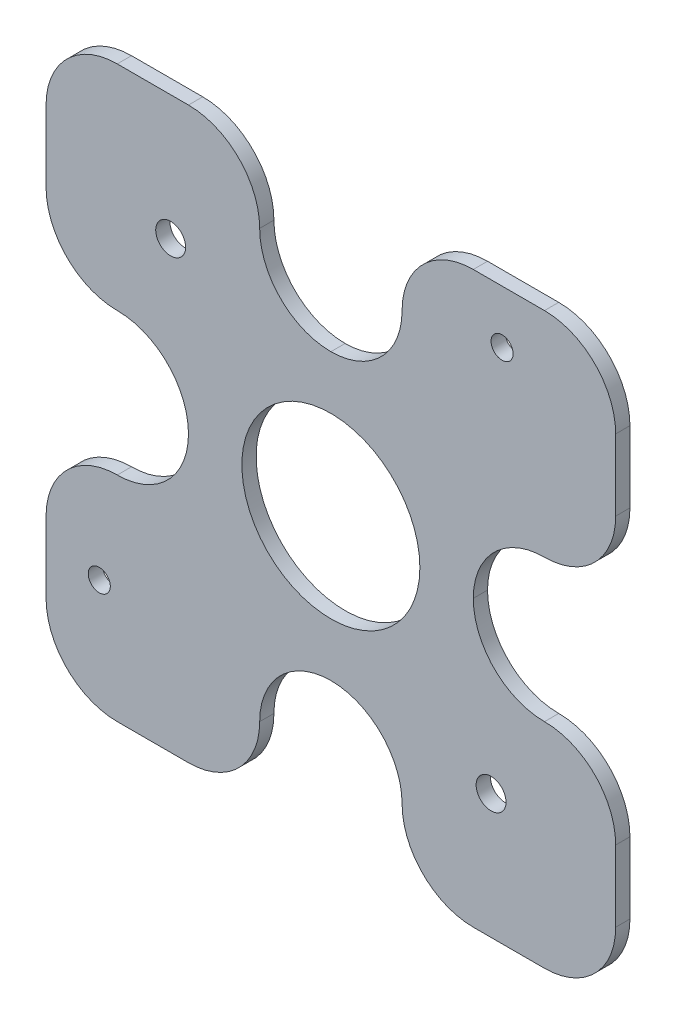
ISO-10303-21;
HEADER;
FILE_DESCRIPTION(('STEP AP214'),'2;1');
FILE_NAME('part.step','',(''),(''),'','','');
FILE_SCHEMA(('AUTOMOTIVE_DESIGN { 1 0 10303 214 1 1 1 1 }'));
ENDSEC;
DATA;
#1=APPLICATION_CONTEXT('core data for automotive mechanical design processes');
#2=APPLICATION_PROTOCOL_DEFINITION('international standard','automotive_design',2000,#1);
#3=PRODUCT_CONTEXT('',#1,'mechanical');
#4=PRODUCT('Part','Part','',(#3));
#5=PRODUCT_RELATED_PRODUCT_CATEGORY('part','',(#4));
#6=PRODUCT_DEFINITION_FORMATION('','',#4);
#7=PRODUCT_DEFINITION_CONTEXT('part definition',#1,'design');
#8=PRODUCT_DEFINITION('design','',#6,#7);
#9=PRODUCT_DEFINITION_SHAPE('','',#8);
#10=(LENGTH_UNIT() NAMED_UNIT(*) SI_UNIT(.MILLI.,.METRE.));
#11=(NAMED_UNIT(*) PLANE_ANGLE_UNIT() SI_UNIT($,.RADIAN.));
#12=(NAMED_UNIT(*) SI_UNIT($,.STERADIAN.) SOLID_ANGLE_UNIT());
#13=UNCERTAINTY_MEASURE_WITH_UNIT(LENGTH_MEASURE(1.E-05),#10,'distance_accuracy_value','');
#14=(GEOMETRIC_REPRESENTATION_CONTEXT(3) GLOBAL_UNCERTAINTY_ASSIGNED_CONTEXT((#13)) GLOBAL_UNIT_ASSIGNED_CONTEXT((#10,
#11,#12)) REPRESENTATION_CONTEXT('',''));
#15=CARTESIAN_POINT('',(0.,0.,0.));
#16=DIRECTION('',(0.,0.,1.));
#17=DIRECTION('',(1.,0.,0.));
#18=AXIS2_PLACEMENT_3D('',#15,#16,#17);
#19=CARTESIAN_POINT('',(0.,0.,2.));
#20=DIRECTION('',(1.,0.,0.));
#21=DIRECTION('',(0.,0.,-1.));
#22=AXIS2_PLACEMENT_3D('',#19,#20,#21);
#23=PLANE('',#22);
#24=DIRECTION('',(0.,-1.,0.));
#25=VECTOR('',#24,1.);
#26=CARTESIAN_POINT('',(0.,0.,0.));
#27=LINE('',#26,#25);
#28=CARTESIAN_POINT('',(0.,70.,0.));
#29=VERTEX_POINT('',#28);
#30=CARTESIAN_POINT('',(0.,60.0000000000001,0.));
#31=VERTEX_POINT('',#30);
#32=EDGE_CURVE('E239',#29,#31,#27,.T.);
#33=ORIENTED_EDGE('',*,*,#32,.T.);
#34=DIRECTION('',(0.,0.,1.));
#35=VECTOR('',#34,1.);
#36=CARTESIAN_POINT('',(0.,60.0000000000001,2.));
#37=LINE('',#36,#35);
#38=CARTESIAN_POINT('',(0.,60.0000000000001,2.));
#39=VERTEX_POINT('',#38);
#40=EDGE_CURVE('E243',#31,#39,#37,.T.);
#41=ORIENTED_EDGE('',*,*,#40,.T.);
#42=DIRECTION('',(0.,-1.,0.));
#43=VECTOR('',#42,1.);
#44=CARTESIAN_POINT('',(0.,0.,2.));
#45=LINE('',#44,#43);
#46=CARTESIAN_POINT('',(0.,70.,2.));
#47=VERTEX_POINT('',#46);
#48=EDGE_CURVE('E242',#47,#39,#45,.T.);
#49=ORIENTED_EDGE('',*,*,#48,.F.);
#50=DIRECTION('',(0.,0.,-1.));
#51=VECTOR('',#50,1.);
#52=CARTESIAN_POINT('',(0.,70.,2.));
#53=LINE('',#52,#51);
#54=EDGE_CURVE('E227',#47,#29,#53,.T.);
#55=ORIENTED_EDGE('',*,*,#54,.T.);
#56=EDGE_LOOP('',(#33,#41,#49,#55));
#57=FACE_BOUND('',#56,.T.);
#58=ADVANCED_FACE('F39',(#57),#23,.F.);
#59=CARTESIAN_POINT('',(0.,0.,2.));
#60=DIRECTION('',(0.,1.,0.));
#61=DIRECTION('',(0.,0.,1.));
#62=AXIS2_PLACEMENT_3D('',#59,#60,#61);
#63=PLANE('',#62);
#64=DIRECTION('',(1.,0.,0.));
#65=VECTOR('',#64,1.);
#66=CARTESIAN_POINT('',(0.,0.,2.));
#67=LINE('',#66,#65);
#68=CARTESIAN_POINT('',(10.,0.,2.));
#69=VERTEX_POINT('',#68);
#70=CARTESIAN_POINT('',(20.0000000000002,0.,2.));
#71=VERTEX_POINT('',#70);
#72=EDGE_CURVE('E431',#69,#71,#67,.T.);
#73=ORIENTED_EDGE('',*,*,#72,.F.);
#74=DIRECTION('',(0.,0.,-1.));
#75=VECTOR('',#74,1.);
#76=CARTESIAN_POINT('',(10.,0.,2.));
#77=LINE('',#76,#75);
#78=CARTESIAN_POINT('',(10.,0.,0.));
#79=VERTEX_POINT('',#78);
#80=EDGE_CURVE('E321',#69,#79,#77,.T.);
#81=ORIENTED_EDGE('',*,*,#80,.T.);
#82=DIRECTION('',(1.,0.,0.));
#83=VECTOR('',#82,1.);
#84=CARTESIAN_POINT('',(0.,0.,0.));
#85=LINE('',#84,#83);
#86=CARTESIAN_POINT('',(20.0000000000002,0.,0.));
#87=VERTEX_POINT('',#86);
#88=EDGE_CURVE('E254',#79,#87,#85,.T.);
#89=ORIENTED_EDGE('',*,*,#88,.T.);
#90=DIRECTION('',(0.,0.,1.));
#91=VECTOR('',#90,1.);
#92=CARTESIAN_POINT('',(20.0000000000002,0.,2.));
#93=LINE('',#92,#91);
#94=EDGE_CURVE('E318',#87,#71,#93,.T.);
#95=ORIENTED_EDGE('',*,*,#94,.T.);
#96=EDGE_LOOP('',(#73,#81,#89,#95));
#97=FACE_BOUND('',#96,.T.);
#98=ADVANCED_FACE('F488',(#97),#63,.F.);
#99=CARTESIAN_POINT('',(80.,0.,2.));
#100=DIRECTION('',(-1.,0.,0.));
#101=DIRECTION('',(0.,0.,1.));
#102=AXIS2_PLACEMENT_3D('',#99,#100,#101);
#103=PLANE('',#102);
#104=DIRECTION('',(0.,1.,0.));
#105=VECTOR('',#104,1.);
#106=CARTESIAN_POINT('',(80.,0.,2.));
#107=LINE('',#106,#105);
#108=CARTESIAN_POINT('',(80.,10.,2.));
#109=VERTEX_POINT('',#108);
#110=CARTESIAN_POINT('',(80.,20.0000000000001,2.));
#111=VERTEX_POINT('',#110);
#112=EDGE_CURVE('E425',#109,#111,#107,.T.);
#113=ORIENTED_EDGE('',*,*,#112,.F.);
#114=DIRECTION('',(0.,0.,-1.));
#115=VECTOR('',#114,1.);
#116=CARTESIAN_POINT('',(80.,10.,2.));
#117=LINE('',#116,#115);
#118=CARTESIAN_POINT('',(80.,10.,0.));
#119=VERTEX_POINT('',#118);
#120=EDGE_CURVE('E331',#109,#119,#117,.T.);
#121=ORIENTED_EDGE('',*,*,#120,.T.);
#122=DIRECTION('',(0.,1.,0.));
#123=VECTOR('',#122,1.);
#124=CARTESIAN_POINT('',(80.,0.,0.));
#125=LINE('',#124,#123);
#126=CARTESIAN_POINT('',(80.,20.0000000000001,0.));
#127=VERTEX_POINT('',#126);
#128=EDGE_CURVE('E264',#119,#127,#125,.T.);
#129=ORIENTED_EDGE('',*,*,#128,.T.);
#130=DIRECTION('',(0.,0.,1.));
#131=VECTOR('',#130,1.);
#132=CARTESIAN_POINT('',(80.,20.0000000000001,2.));
#133=LINE('',#132,#131);
#134=EDGE_CURVE('E328',#127,#111,#133,.T.);
#135=ORIENTED_EDGE('',*,*,#134,.T.);
#136=EDGE_LOOP('',(#113,#121,#129,#135));
#137=FACE_BOUND('',#136,.T.);
#138=ADVANCED_FACE('F483',(#137),#103,.F.);
#139=CARTESIAN_POINT('',(0.,80.,2.));
#140=DIRECTION('',(0.,-1.,0.));
#141=DIRECTION('',(0.,0.,-1.));
#142=AXIS2_PLACEMENT_3D('',#139,#140,#141);
#143=PLANE('',#142);
#144=DIRECTION('',(-1.,0.,0.));
#145=VECTOR('',#144,1.);
#146=CARTESIAN_POINT('',(0.,80.,2.));
#147=LINE('',#146,#145);
#148=CARTESIAN_POINT('',(70.,80.,2.));
#149=VERTEX_POINT('',#148);
#150=CARTESIAN_POINT('',(60.0000000000002,80.,2.));
#151=VERTEX_POINT('',#150);
#152=EDGE_CURVE('E244',#149,#151,#147,.T.);
#153=ORIENTED_EDGE('',*,*,#152,.F.);
#154=DIRECTION('',(0.,0.,-1.));
#155=VECTOR('',#154,1.);
#156=CARTESIAN_POINT('',(70.,80.,2.));
#157=LINE('',#156,#155);
#158=CARTESIAN_POINT('',(70.,80.,0.));
#159=VERTEX_POINT('',#158);
#160=EDGE_CURVE('E341',#149,#159,#157,.T.);
#161=ORIENTED_EDGE('',*,*,#160,.T.);
#162=DIRECTION('',(-1.,0.,0.));
#163=VECTOR('',#162,1.);
#164=CARTESIAN_POINT('',(0.,80.,0.));
#165=LINE('',#164,#163);
#166=CARTESIAN_POINT('',(60.0000000000002,80.,0.));
#167=VERTEX_POINT('',#166);
#168=EDGE_CURVE('E268',#159,#167,#165,.T.);
#169=ORIENTED_EDGE('',*,*,#168,.T.);
#170=DIRECTION('',(0.,0.,1.));
#171=VECTOR('',#170,1.);
#172=CARTESIAN_POINT('',(60.0000000000002,80.,2.));
#173=LINE('',#172,#171);
#174=EDGE_CURVE('E338',#167,#151,#173,.T.);
#175=ORIENTED_EDGE('',*,*,#174,.T.);
#176=EDGE_LOOP('',(#153,#161,#169,#175));
#177=FACE_BOUND('',#176,.T.);
#178=ADVANCED_FACE('F475',(#177),#143,.F.);
#179=CARTESIAN_POINT('',(0.,0.,2.));
#180=DIRECTION('',(0.,0.,-1.));
#181=DIRECTION('',(-1.,0.,0.));
#182=AXIS2_PLACEMENT_3D('',#179,#180,#181);
#183=PLANE('',#182);
#184=CARTESIAN_POINT('',(40.0000000000003,40.,2.));
#185=DIRECTION('',(0.,0.,1.));
#186=DIRECTION('',(1.,0.,0.));
#187=AXIS2_PLACEMENT_3D('',#184,#185,#186);
#188=CIRCLE('',#187,12.5);
#189=CARTESIAN_POINT('',(52.5000000000003,40.,2.));
#190=VERTEX_POINT('',#189);
#191=EDGE_CURVE('E461',#190,#190,#188,.T.);
#192=ORIENTED_EDGE('',*,*,#191,.F.);
#193=EDGE_LOOP('',(#192));
#194=FACE_BOUND('',#193,.T.);
#195=ORIENTED_EDGE('',*,*,#48,.T.);
#196=CARTESIAN_POINT('',(10.,60.0000000000001,2.));
#197=DIRECTION('',(0.,0.,-1.));
#198=DIRECTION('',(-1.,0.,0.));
#199=AXIS2_PLACEMENT_3D('',#196,#197,#198);
#200=CIRCLE('',#199,10.);
#201=CARTESIAN_POINT('',(10.,50.0000000000001,2.));
#202=VERTEX_POINT('',#201);
#203=EDGE_CURVE('E233',#39,#202,#200,.F.);
#204=ORIENTED_EDGE('',*,*,#203,.T.);
#205=CARTESIAN_POINT('',(10.0000000000003,40.0000000000001,2.));
#206=DIRECTION('',(0.,0.,-1.));
#207=DIRECTION('',(-1.,0.,0.));
#208=AXIS2_PLACEMENT_3D('',#205,#206,#207);
#209=CIRCLE('',#208,10.);
#210=CARTESIAN_POINT('',(20.0000000000003,40.0000000000001,2.));
#211=VERTEX_POINT('',#210);
#212=EDGE_CURVE('E347',#202,#211,#209,.T.);
#213=ORIENTED_EDGE('',*,*,#212,.T.);
#214=CARTESIAN_POINT('',(10.0000000000003,40.0000000000001,2.));
#215=DIRECTION('',(0.,0.,-1.));
#216=DIRECTION('',(-1.,0.,0.));
#217=AXIS2_PLACEMENT_3D('',#214,#215,#216);
#218=CIRCLE('',#217,10.);
#219=CARTESIAN_POINT('',(10.,30.0000000000001,2.));
#220=VERTEX_POINT('',#219);
#221=EDGE_CURVE('E351',#211,#220,#218,.T.);
#222=ORIENTED_EDGE('',*,*,#221,.T.);
#223=CARTESIAN_POINT('',(10.,20.0000000000001,2.));
#224=DIRECTION('',(0.,0.,-1.));
#225=DIRECTION('',(-1.,0.,0.));
#226=AXIS2_PLACEMENT_3D('',#223,#224,#225);
#227=CIRCLE('',#226,10.);
#228=CARTESIAN_POINT('',(0.,20.0000000000001,2.));
#229=VERTEX_POINT('',#228);
#230=EDGE_CURVE('E291',#220,#229,#227,.F.);
#231=ORIENTED_EDGE('',*,*,#230,.T.);
#232=CARTESIAN_POINT('',(0.,10.,2.));
#233=VERTEX_POINT('',#232);
#234=EDGE_CURVE('E436',#229,#233,#45,.T.);
#235=ORIENTED_EDGE('',*,*,#234,.T.);
#236=CARTESIAN_POINT('',(10.,10.,2.));
#237=DIRECTION('',(0.,0.,-1.));
#238=DIRECTION('',(-1.,0.,0.));
#239=AXIS2_PLACEMENT_3D('',#236,#237,#238);
#240=CIRCLE('',#239,10.);
#241=EDGE_CURVE('E289',#233,#69,#240,.F.);
#242=ORIENTED_EDGE('',*,*,#241,.T.);
#243=ORIENTED_EDGE('',*,*,#72,.T.);
#244=CARTESIAN_POINT('',(20.0000000000002,10.,2.));
#245=DIRECTION('',(0.,0.,-1.));
#246=DIRECTION('',(-1.,0.,0.));
#247=AXIS2_PLACEMENT_3D('',#244,#245,#246);
#248=CIRCLE('',#247,10.);
#249=CARTESIAN_POINT('',(30.0000000000002,10.,2.));
#250=VERTEX_POINT('',#249);
#251=EDGE_CURVE('E287',#71,#250,#248,.F.);
#252=ORIENTED_EDGE('',*,*,#251,.T.);
#253=CARTESIAN_POINT('',(40.0000000000002,10.0000000000002,2.));
#254=DIRECTION('',(0.,0.,-1.));
#255=DIRECTION('',(-1.,0.,0.));
#256=AXIS2_PLACEMENT_3D('',#253,#254,#255);
#257=CIRCLE('',#256,10.);
#258=CARTESIAN_POINT('',(40.0000000000002,20.0000000000002,2.));
#259=VERTEX_POINT('',#258);
#260=EDGE_CURVE('E355',#250,#259,#257,.T.);
#261=ORIENTED_EDGE('',*,*,#260,.T.);
#262=CARTESIAN_POINT('',(40.0000000000002,10.0000000000002,2.));
#263=DIRECTION('',(0.,0.,-1.));
#264=DIRECTION('',(-1.,0.,0.));
#265=AXIS2_PLACEMENT_3D('',#262,#263,#264);
#266=CIRCLE('',#265,10.);
#267=CARTESIAN_POINT('',(50.0000000000002,10.,2.));
#268=VERTEX_POINT('',#267);
#269=EDGE_CURVE('E359',#259,#268,#266,.T.);
#270=ORIENTED_EDGE('',*,*,#269,.T.);
#271=CARTESIAN_POINT('',(60.0000000000002,10.,2.));
#272=DIRECTION('',(0.,0.,-1.));
#273=DIRECTION('',(-1.,0.,0.));
#274=AXIS2_PLACEMENT_3D('',#271,#272,#273);
#275=CIRCLE('',#274,10.);
#276=CARTESIAN_POINT('',(60.0000000000002,0.,2.));
#277=VERTEX_POINT('',#276);
#278=EDGE_CURVE('E285',#268,#277,#275,.F.);
#279=ORIENTED_EDGE('',*,*,#278,.T.);
#280=CARTESIAN_POINT('',(70.,0.,2.));
#281=VERTEX_POINT('',#280);
#282=EDGE_CURVE('E433',#277,#281,#67,.T.);
#283=ORIENTED_EDGE('',*,*,#282,.T.);
#284=CARTESIAN_POINT('',(70.,10.,2.));
#285=DIRECTION('',(0.,0.,-1.));
#286=DIRECTION('',(-1.,0.,0.));
#287=AXIS2_PLACEMENT_3D('',#284,#285,#286);
#288=CIRCLE('',#287,10.);
#289=EDGE_CURVE('E283',#281,#109,#288,.F.);
#290=ORIENTED_EDGE('',*,*,#289,.T.);
#291=ORIENTED_EDGE('',*,*,#112,.T.);
#292=CARTESIAN_POINT('',(70.,20.0000000000001,2.));
#293=DIRECTION('',(0.,0.,-1.));
#294=DIRECTION('',(-1.,0.,0.));
#295=AXIS2_PLACEMENT_3D('',#292,#293,#294);
#296=CIRCLE('',#295,10.);
#297=CARTESIAN_POINT('',(70.,30.0000000000001,2.));
#298=VERTEX_POINT('',#297);
#299=EDGE_CURVE('E281',#111,#298,#296,.F.);
#300=ORIENTED_EDGE('',*,*,#299,.T.);
#301=CARTESIAN_POINT('',(70.0000000000001,40.0000000000001,2.));
#302=DIRECTION('',(0.,0.,-1.));
#303=DIRECTION('',(-1.,0.,0.));
#304=AXIS2_PLACEMENT_3D('',#301,#302,#303);
#305=CIRCLE('',#304,10.);
#306=CARTESIAN_POINT('',(60.0000000000001,40.0000000000001,2.));
#307=VERTEX_POINT('',#306);
#308=EDGE_CURVE('E363',#298,#307,#305,.T.);
#309=ORIENTED_EDGE('',*,*,#308,.T.);
#310=CARTESIAN_POINT('',(70.0000000000001,40.0000000000001,2.));
#311=DIRECTION('',(0.,0.,-1.));
#312=DIRECTION('',(-1.,0.,0.));
#313=AXIS2_PLACEMENT_3D('',#310,#311,#312);
#314=CIRCLE('',#313,10.);
#315=CARTESIAN_POINT('',(70.,50.0000000000001,2.));
#316=VERTEX_POINT('',#315);
#317=EDGE_CURVE('E367',#307,#316,#314,.T.);
#318=ORIENTED_EDGE('',*,*,#317,.T.);
#319=CARTESIAN_POINT('',(70.,60.0000000000001,2.));
#320=DIRECTION('',(0.,0.,-1.));
#321=DIRECTION('',(-1.,0.,0.));
#322=AXIS2_PLACEMENT_3D('',#319,#320,#321);
#323=CIRCLE('',#322,10.);
#324=CARTESIAN_POINT('',(80.,60.0000000000001,2.));
#325=VERTEX_POINT('',#324);
#326=EDGE_CURVE('E279',#316,#325,#323,.F.);
#327=ORIENTED_EDGE('',*,*,#326,.T.);
#328=CARTESIAN_POINT('',(80.,70.,2.));
#329=VERTEX_POINT('',#328);
#330=EDGE_CURVE('E428',#325,#329,#107,.T.);
#331=ORIENTED_EDGE('',*,*,#330,.T.);
#332=CARTESIAN_POINT('',(70.,70.,2.));
#333=DIRECTION('',(0.,0.,-1.));
#334=DIRECTION('',(-1.,0.,0.));
#335=AXIS2_PLACEMENT_3D('',#332,#333,#334);
#336=CIRCLE('',#335,10.);
#337=EDGE_CURVE('E277',#329,#149,#336,.F.);
#338=ORIENTED_EDGE('',*,*,#337,.T.);
#339=ORIENTED_EDGE('',*,*,#152,.T.);
#340=CARTESIAN_POINT('',(60.0000000000002,70.,2.));
#341=DIRECTION('',(0.,0.,-1.));
#342=DIRECTION('',(-1.,0.,0.));
#343=AXIS2_PLACEMENT_3D('',#340,#341,#342);
#344=CIRCLE('',#343,10.);
#345=CARTESIAN_POINT('',(50.0000000000002,70.,2.));
#346=VERTEX_POINT('',#345);
#347=EDGE_CURVE('E275',#151,#346,#344,.F.);
#348=ORIENTED_EDGE('',*,*,#347,.T.);
#349=CARTESIAN_POINT('',(40.0000000000002,70.,2.));
#350=DIRECTION('',(0.,0.,-1.));
#351=DIRECTION('',(-1.,0.,0.));
#352=AXIS2_PLACEMENT_3D('',#349,#350,#351);
#353=CIRCLE('',#352,10.);
#354=CARTESIAN_POINT('',(40.0000000000002,60.,2.));
#355=VERTEX_POINT('',#354);
#356=EDGE_CURVE('E62',#346,#355,#353,.T.);
#357=ORIENTED_EDGE('',*,*,#356,.T.);
#358=CARTESIAN_POINT('',(40.0000000000002,70.,2.));
#359=DIRECTION('',(0.,0.,-1.));
#360=DIRECTION('',(-1.,0.,0.));
#361=AXIS2_PLACEMENT_3D('',#358,#359,#360);
#362=CIRCLE('',#361,10.);
#363=CARTESIAN_POINT('',(30.0000000000002,70.,2.));
#364=VERTEX_POINT('',#363);
#365=EDGE_CURVE('E48',#355,#364,#362,.T.);
#366=ORIENTED_EDGE('',*,*,#365,.T.);
#367=CARTESIAN_POINT('',(20.0000000000002,70.,2.));
#368=DIRECTION('',(0.,0.,-1.));
#369=DIRECTION('',(-1.,0.,0.));
#370=AXIS2_PLACEMENT_3D('',#367,#368,#369);
#371=CIRCLE('',#370,10.);
#372=CARTESIAN_POINT('',(20.0000000000002,80.,2.));
#373=VERTEX_POINT('',#372);
#374=EDGE_CURVE('E273',#364,#373,#371,.F.);
#375=ORIENTED_EDGE('',*,*,#374,.T.);
#376=CARTESIAN_POINT('',(10.,80.,2.));
#377=VERTEX_POINT('',#376);
#378=EDGE_CURVE('E259',#373,#377,#147,.T.);
#379=ORIENTED_EDGE('',*,*,#378,.T.);
#380=CARTESIAN_POINT('',(10.,70.,2.));
#381=DIRECTION('',(0.,0.,-1.));
#382=DIRECTION('',(-1.,0.,0.));
#383=AXIS2_PLACEMENT_3D('',#380,#381,#382);
#384=CIRCLE('',#383,10.);
#385=EDGE_CURVE('E271',#377,#47,#384,.F.);
#386=ORIENTED_EDGE('',*,*,#385,.T.);
#387=EDGE_LOOP('',(#195,#204,#213,#222,#231,#235,#242,#243,#252,#261,#270,#279,#283,#290,#291,
#300,#309,#318,#327,#331,#338,#339,#348,#357,#366,#375,#379,#386));
#388=FACE_BOUND('',#387,.T.);
#389=CARTESIAN_POINT('',(17.5,62.5,2.));
#390=DIRECTION('',(0.,0.,1.));
#391=DIRECTION('',(1.,0.,0.));
#392=AXIS2_PLACEMENT_3D('',#389,#390,#391);
#393=CIRCLE('',#392,2.1);
#394=CARTESIAN_POINT('',(19.6,62.5,2.));
#395=VERTEX_POINT('',#394);
#396=EDGE_CURVE('E257',#395,#395,#393,.T.);
#397=ORIENTED_EDGE('',*,*,#396,.F.);
#398=EDGE_LOOP('',(#397));
#399=FACE_BOUND('',#398,.T.);
#400=CARTESIAN_POINT('',(62.5,17.5,2.));
#401=DIRECTION('',(0.,0.,1.));
#402=DIRECTION('',(1.,0.,0.));
#403=AXIS2_PLACEMENT_3D('',#400,#401,#402);
#404=CIRCLE('',#403,2.10000000000009);
#405=CARTESIAN_POINT('',(64.6000000000001,17.5,2.));
#406=VERTEX_POINT('',#405);
#407=EDGE_CURVE('E442',#406,#406,#404,.T.);
#408=ORIENTED_EDGE('',*,*,#407,.F.);
#409=EDGE_LOOP('',(#408));
#410=FACE_BOUND('',#409,.T.);
#411=CARTESIAN_POINT('',(7.47308806541882,15.9583694396574,2.));
#412=DIRECTION('',(0.,0.,1.));
#413=DIRECTION('',(1.,0.,0.));
#414=AXIS2_PLACEMENT_3D('',#411,#412,#413);
#415=CIRCLE('',#414,1.55);
#416=CARTESIAN_POINT('',(9.02308806541882,15.9583694396574,2.));
#417=VERTEX_POINT('',#416);
#418=EDGE_CURVE('E448',#417,#417,#415,.T.);
#419=ORIENTED_EDGE('',*,*,#418,.F.);
#420=EDGE_LOOP('',(#419));
#421=FACE_BOUND('',#420,.T.);
#422=CARTESIAN_POINT('',(64.0416305603426,72.5269119345812,2.));
#423=DIRECTION('',(0.,0.,1.));
#424=DIRECTION('',(-1.,0.,0.));
#425=AXIS2_PLACEMENT_3D('',#422,#423,#424);
#426=CIRCLE('',#425,1.54999999999999);
#427=CARTESIAN_POINT('',(62.4916305603426,72.5269119345812,2.));
#428=VERTEX_POINT('',#427);
#429=EDGE_CURVE('E454',#428,#428,#426,.T.);
#430=ORIENTED_EDGE('',*,*,#429,.F.);
#431=EDGE_LOOP('',(#430));
#432=FACE_BOUND('',#431,.T.);
#433=ADVANCED_FACE('F421',(#194,#388,#399,#410,#421,#432),#183,.F.);
#434=CARTESIAN_POINT('',(0.,0.,0.));
#435=DIRECTION('',(0.,0.,-1.));
#436=DIRECTION('',(-1.,0.,0.));
#437=AXIS2_PLACEMENT_3D('',#434,#435,#436);
#438=PLANE('',#437);
#439=CARTESIAN_POINT('',(40.0000000000003,40.,0.));
#440=DIRECTION('',(0.,0.,1.));
#441=DIRECTION('',(1.,0.,0.));
#442=AXIS2_PLACEMENT_3D('',#439,#440,#441);
#443=CIRCLE('',#442,12.5);
#444=CARTESIAN_POINT('',(52.5000000000003,40.,0.));
#445=VERTEX_POINT('',#444);
#446=EDGE_CURVE('E406',#445,#445,#443,.T.);
#447=ORIENTED_EDGE('',*,*,#446,.T.);
#448=EDGE_LOOP('',(#447));
#449=FACE_BOUND('',#448,.T.);
#450=CARTESIAN_POINT('',(10.,20.0000000000001,0.));
#451=DIRECTION('',(0.,0.,-1.));
#452=DIRECTION('',(-1.,0.,0.));
#453=AXIS2_PLACEMENT_3D('',#450,#451,#452);
#454=CIRCLE('',#453,10.);
#455=CARTESIAN_POINT('',(0.,20.0000000000001,0.));
#456=VERTEX_POINT('',#455);
#457=CARTESIAN_POINT('',(10.,30.0000000000001,0.));
#458=VERTEX_POINT('',#457);
#459=EDGE_CURVE('E311',#456,#458,#454,.T.);
#460=ORIENTED_EDGE('',*,*,#459,.T.);
#461=CARTESIAN_POINT('',(10.0000000000003,40.0000000000001,0.));
#462=DIRECTION('',(0.,0.,-1.));
#463=DIRECTION('',(-1.,0.,0.));
#464=AXIS2_PLACEMENT_3D('',#461,#462,#463);
#465=CIRCLE('',#464,10.);
#466=CARTESIAN_POINT('',(20.0000000000003,40.0000000000001,0.));
#467=VERTEX_POINT('',#466);
#468=EDGE_CURVE('E353',#458,#467,#465,.F.);
#469=ORIENTED_EDGE('',*,*,#468,.T.);
#470=CARTESIAN_POINT('',(10.0000000000003,40.0000000000001,0.));
#471=DIRECTION('',(0.,0.,-1.));
#472=DIRECTION('',(-1.,0.,0.));
#473=AXIS2_PLACEMENT_3D('',#470,#471,#472);
#474=CIRCLE('',#473,10.);
#475=CARTESIAN_POINT('',(10.,50.0000000000001,0.));
#476=VERTEX_POINT('',#475);
#477=EDGE_CURVE('E349',#467,#476,#474,.F.);
#478=ORIENTED_EDGE('',*,*,#477,.T.);
#479=CARTESIAN_POINT('',(10.,60.0000000000001,0.));
#480=DIRECTION('',(0.,0.,-1.));
#481=DIRECTION('',(-1.,0.,0.));
#482=AXIS2_PLACEMENT_3D('',#479,#480,#481);
#483=CIRCLE('',#482,10.);
#484=EDGE_CURVE('E249',#476,#31,#483,.T.);
#485=ORIENTED_EDGE('',*,*,#484,.T.);
#486=ORIENTED_EDGE('',*,*,#32,.F.);
#487=CARTESIAN_POINT('',(10.,70.,0.));
#488=DIRECTION('',(0.,0.,-1.));
#489=DIRECTION('',(-1.,0.,0.));
#490=AXIS2_PLACEMENT_3D('',#487,#488,#489);
#491=CIRCLE('',#490,10.);
#492=CARTESIAN_POINT('',(10.,80.,0.));
#493=VERTEX_POINT('',#492);
#494=EDGE_CURVE('E224',#29,#493,#491,.T.);
#495=ORIENTED_EDGE('',*,*,#494,.T.);
#496=CARTESIAN_POINT('',(20.0000000000002,80.,0.));
#497=VERTEX_POINT('',#496);
#498=EDGE_CURVE('E267',#497,#493,#165,.T.);
#499=ORIENTED_EDGE('',*,*,#498,.F.);
#500=CARTESIAN_POINT('',(20.0000000000002,70.,0.));
#501=DIRECTION('',(0.,0.,-1.));
#502=DIRECTION('',(-1.,0.,0.));
#503=AXIS2_PLACEMENT_3D('',#500,#501,#502);
#504=CIRCLE('',#503,10.);
#505=CARTESIAN_POINT('',(30.0000000000002,70.,0.));
#506=VERTEX_POINT('',#505);
#507=EDGE_CURVE('E232',#497,#506,#504,.T.);
#508=ORIENTED_EDGE('',*,*,#507,.T.);
#509=CARTESIAN_POINT('',(40.0000000000002,70.,0.));
#510=DIRECTION('',(0.,0.,-1.));
#511=DIRECTION('',(-1.,0.,0.));
#512=AXIS2_PLACEMENT_3D('',#509,#510,#511);
#513=CIRCLE('',#512,10.);
#514=CARTESIAN_POINT('',(40.0000000000002,60.,0.));
#515=VERTEX_POINT('',#514);
#516=EDGE_CURVE('E11',#506,#515,#513,.F.);
#517=ORIENTED_EDGE('',*,*,#516,.T.);
#518=CARTESIAN_POINT('',(40.0000000000002,70.,0.));
#519=DIRECTION('',(0.,0.,-1.));
#520=DIRECTION('',(-1.,0.,0.));
#521=AXIS2_PLACEMENT_3D('',#518,#519,#520);
#522=CIRCLE('',#521,10.);
#523=CARTESIAN_POINT('',(50.0000000000002,70.,0.));
#524=VERTEX_POINT('',#523);
#525=EDGE_CURVE('E372',#515,#524,#522,.F.);
#526=ORIENTED_EDGE('',*,*,#525,.T.);
#527=CARTESIAN_POINT('',(60.0000000000002,70.,0.));
#528=DIRECTION('',(0.,0.,-1.));
#529=DIRECTION('',(-1.,0.,0.));
#530=AXIS2_PLACEMENT_3D('',#527,#528,#529);
#531=CIRCLE('',#530,10.);
#532=EDGE_CURVE('E295',#524,#167,#531,.T.);
#533=ORIENTED_EDGE('',*,*,#532,.T.);
#534=ORIENTED_EDGE('',*,*,#168,.F.);
#535=CARTESIAN_POINT('',(70.,70.,0.));
#536=DIRECTION('',(0.,0.,-1.));
#537=DIRECTION('',(-1.,0.,0.));
#538=AXIS2_PLACEMENT_3D('',#535,#536,#537);
#539=CIRCLE('',#538,10.);
#540=CARTESIAN_POINT('',(80.,70.,0.));
#541=VERTEX_POINT('',#540);
#542=EDGE_CURVE('E297',#159,#541,#539,.T.);
#543=ORIENTED_EDGE('',*,*,#542,.T.);
#544=CARTESIAN_POINT('',(80.,60.0000000000001,0.));
#545=VERTEX_POINT('',#544);
#546=EDGE_CURVE('E263',#545,#541,#125,.T.);
#547=ORIENTED_EDGE('',*,*,#546,.F.);
#548=CARTESIAN_POINT('',(70.,60.0000000000001,0.));
#549=DIRECTION('',(0.,0.,-1.));
#550=DIRECTION('',(-1.,0.,0.));
#551=AXIS2_PLACEMENT_3D('',#548,#549,#550);
#552=CIRCLE('',#551,10.);
#553=CARTESIAN_POINT('',(70.,50.0000000000001,0.));
#554=VERTEX_POINT('',#553);
#555=EDGE_CURVE('E299',#545,#554,#552,.T.);
#556=ORIENTED_EDGE('',*,*,#555,.T.);
#557=CARTESIAN_POINT('',(70.0000000000001,40.0000000000001,0.));
#558=DIRECTION('',(0.,0.,-1.));
#559=DIRECTION('',(-1.,0.,0.));
#560=AXIS2_PLACEMENT_3D('',#557,#558,#559);
#561=CIRCLE('',#560,10.);
#562=CARTESIAN_POINT('',(60.0000000000001,40.0000000000001,0.));
#563=VERTEX_POINT('',#562);
#564=EDGE_CURVE('E369',#554,#563,#561,.F.);
#565=ORIENTED_EDGE('',*,*,#564,.T.);
#566=CARTESIAN_POINT('',(70.0000000000001,40.0000000000001,0.));
#567=DIRECTION('',(0.,0.,-1.));
#568=DIRECTION('',(-1.,0.,0.));
#569=AXIS2_PLACEMENT_3D('',#566,#567,#568);
#570=CIRCLE('',#569,10.);
#571=CARTESIAN_POINT('',(70.,30.0000000000001,0.));
#572=VERTEX_POINT('',#571);
#573=EDGE_CURVE('E365',#563,#572,#570,.F.);
#574=ORIENTED_EDGE('',*,*,#573,.T.);
#575=CARTESIAN_POINT('',(70.,20.0000000000001,0.));
#576=DIRECTION('',(0.,0.,-1.));
#577=DIRECTION('',(-1.,0.,0.));
#578=AXIS2_PLACEMENT_3D('',#575,#576,#577);
#579=CIRCLE('',#578,10.);
#580=EDGE_CURVE('E301',#572,#127,#579,.T.);
#581=ORIENTED_EDGE('',*,*,#580,.T.);
#582=ORIENTED_EDGE('',*,*,#128,.F.);
#583=CARTESIAN_POINT('',(70.,10.,0.));
#584=DIRECTION('',(0.,0.,-1.));
#585=DIRECTION('',(-1.,0.,0.));
#586=AXIS2_PLACEMENT_3D('',#583,#584,#585);
#587=CIRCLE('',#586,10.);
#588=CARTESIAN_POINT('',(70.,0.,0.));
#589=VERTEX_POINT('',#588);
#590=EDGE_CURVE('E303',#119,#589,#587,.T.);
#591=ORIENTED_EDGE('',*,*,#590,.T.);
#592=CARTESIAN_POINT('',(60.0000000000002,0.,0.));
#593=VERTEX_POINT('',#592);
#594=EDGE_CURVE('E250',#593,#589,#85,.T.);
#595=ORIENTED_EDGE('',*,*,#594,.F.);
#596=CARTESIAN_POINT('',(60.0000000000002,10.,0.));
#597=DIRECTION('',(0.,0.,-1.));
#598=DIRECTION('',(-1.,0.,0.));
#599=AXIS2_PLACEMENT_3D('',#596,#597,#598);
#600=CIRCLE('',#599,10.);
#601=CARTESIAN_POINT('',(50.0000000000002,10.,0.));
#602=VERTEX_POINT('',#601);
#603=EDGE_CURVE('E305',#593,#602,#600,.T.);
#604=ORIENTED_EDGE('',*,*,#603,.T.);
#605=CARTESIAN_POINT('',(40.0000000000002,10.0000000000002,0.));
#606=DIRECTION('',(0.,0.,-1.));
#607=DIRECTION('',(-1.,0.,0.));
#608=AXIS2_PLACEMENT_3D('',#605,#606,#607);
#609=CIRCLE('',#608,10.);
#610=CARTESIAN_POINT('',(40.0000000000002,20.0000000000002,0.));
#611=VERTEX_POINT('',#610);
#612=EDGE_CURVE('E361',#602,#611,#609,.F.);
#613=ORIENTED_EDGE('',*,*,#612,.T.);
#614=CARTESIAN_POINT('',(40.0000000000002,10.0000000000002,0.));
#615=DIRECTION('',(0.,0.,-1.));
#616=DIRECTION('',(-1.,0.,0.));
#617=AXIS2_PLACEMENT_3D('',#614,#615,#616);
#618=CIRCLE('',#617,10.);
#619=CARTESIAN_POINT('',(30.0000000000002,10.,0.));
#620=VERTEX_POINT('',#619);
#621=EDGE_CURVE('E357',#611,#620,#618,.F.);
#622=ORIENTED_EDGE('',*,*,#621,.T.);
#623=CARTESIAN_POINT('',(20.0000000000002,10.,0.));
#624=DIRECTION('',(0.,0.,-1.));
#625=DIRECTION('',(-1.,0.,0.));
#626=AXIS2_PLACEMENT_3D('',#623,#624,#625);
#627=CIRCLE('',#626,10.);
#628=EDGE_CURVE('E307',#620,#87,#627,.T.);
#629=ORIENTED_EDGE('',*,*,#628,.T.);
#630=ORIENTED_EDGE('',*,*,#88,.F.);
#631=CARTESIAN_POINT('',(10.,10.,0.));
#632=DIRECTION('',(0.,0.,-1.));
#633=DIRECTION('',(-1.,0.,0.));
#634=AXIS2_PLACEMENT_3D('',#631,#632,#633);
#635=CIRCLE('',#634,10.);
#636=CARTESIAN_POINT('',(0.,10.,0.));
#637=VERTEX_POINT('',#636);
#638=EDGE_CURVE('E309',#79,#637,#635,.T.);
#639=ORIENTED_EDGE('',*,*,#638,.T.);
#640=EDGE_CURVE('E251',#456,#637,#27,.T.);
#641=ORIENTED_EDGE('',*,*,#640,.F.);
#642=EDGE_LOOP('',(#460,#469,#478,#485,#486,#495,#499,#508,#517,#526,#533,#534,#543,#547,#556,
#565,#574,#581,#582,#591,#595,#604,#613,#622,#629,#630,#639,#641));
#643=FACE_BOUND('',#642,.T.);
#644=CARTESIAN_POINT('',(7.47308806541882,15.9583694396574,0.));
#645=DIRECTION('',(0.,0.,1.));
#646=DIRECTION('',(1.,0.,0.));
#647=AXIS2_PLACEMENT_3D('',#644,#645,#646);
#648=CIRCLE('',#647,1.55);
#649=CARTESIAN_POINT('',(9.02308806541882,15.9583694396574,0.));
#650=VERTEX_POINT('',#649);
#651=EDGE_CURVE('E451',#650,#650,#648,.T.);
#652=ORIENTED_EDGE('',*,*,#651,.T.);
#653=EDGE_LOOP('',(#652));
#654=FACE_BOUND('',#653,.T.);
#655=CARTESIAN_POINT('',(17.5,62.5,0.));
#656=DIRECTION('',(0.,0.,1.));
#657=DIRECTION('',(1.,0.,0.));
#658=AXIS2_PLACEMENT_3D('',#655,#656,#657);
#659=CIRCLE('',#658,2.1);
#660=CARTESIAN_POINT('',(19.6,62.5,0.));
#661=VERTEX_POINT('',#660);
#662=EDGE_CURVE('E439',#661,#661,#659,.T.);
#663=ORIENTED_EDGE('',*,*,#662,.T.);
#664=EDGE_LOOP('',(#663));
#665=FACE_BOUND('',#664,.T.);
#666=CARTESIAN_POINT('',(62.5,17.5,0.));
#667=DIRECTION('',(0.,0.,1.));
#668=DIRECTION('',(1.,0.,0.));
#669=AXIS2_PLACEMENT_3D('',#666,#667,#668);
#670=CIRCLE('',#669,2.10000000000009);
#671=CARTESIAN_POINT('',(64.6000000000001,17.5,0.));
#672=VERTEX_POINT('',#671);
#673=EDGE_CURVE('E445',#672,#672,#670,.T.);
#674=ORIENTED_EDGE('',*,*,#673,.T.);
#675=EDGE_LOOP('',(#674));
#676=FACE_BOUND('',#675,.T.);
#677=CARTESIAN_POINT('',(64.0416305603426,72.5269119345812,0.));
#678=DIRECTION('',(0.,0.,1.));
#679=DIRECTION('',(-1.,0.,0.));
#680=AXIS2_PLACEMENT_3D('',#677,#678,#679);
#681=CIRCLE('',#680,1.54999999999999);
#682=CARTESIAN_POINT('',(62.4916305603426,72.5269119345812,0.));
#683=VERTEX_POINT('',#682);
#684=EDGE_CURVE('E385',#683,#683,#681,.T.);
#685=ORIENTED_EDGE('',*,*,#684,.T.);
#686=EDGE_LOOP('',(#685));
#687=FACE_BOUND('',#686,.T.);
#688=ADVANCED_FACE('F246',(#449,#643,#654,#665,#676,#687),#438,.T.);
#689=ORIENTED_EDGE('',*,*,#234,.F.);
#690=DIRECTION('',(0.,0.,1.));
#691=VECTOR('',#690,1.);
#692=CARTESIAN_POINT('',(0.,20.0000000000001,2.));
#693=LINE('',#692,#691);
#694=EDGE_CURVE('E316',#229,#456,#693,.F.);
#695=ORIENTED_EDGE('',*,*,#694,.T.);
#696=ORIENTED_EDGE('',*,*,#640,.T.);
#697=DIRECTION('',(0.,0.,-1.));
#698=VECTOR('',#697,1.);
#699=CARTESIAN_POINT('',(0.,10.,2.));
#700=LINE('',#699,#698);
#701=EDGE_CURVE('E314',#637,#233,#700,.F.);
#702=ORIENTED_EDGE('',*,*,#701,.T.);
#703=EDGE_LOOP('',(#689,#695,#696,#702));
#704=FACE_BOUND('',#703,.T.);
#705=ADVANCED_FACE('F481',(#704),#23,.F.);
#706=ORIENTED_EDGE('',*,*,#282,.F.);
#707=DIRECTION('',(0.,0.,1.));
#708=VECTOR('',#707,1.);
#709=CARTESIAN_POINT('',(60.0000000000002,0.,2.));
#710=LINE('',#709,#708);
#711=EDGE_CURVE('E326',#277,#593,#710,.F.);
#712=ORIENTED_EDGE('',*,*,#711,.T.);
#713=ORIENTED_EDGE('',*,*,#594,.T.);
#714=DIRECTION('',(0.,0.,-1.));
#715=VECTOR('',#714,1.);
#716=CARTESIAN_POINT('',(70.,0.,2.));
#717=LINE('',#716,#715);
#718=EDGE_CURVE('E324',#589,#281,#717,.F.);
#719=ORIENTED_EDGE('',*,*,#718,.T.);
#720=EDGE_LOOP('',(#706,#712,#713,#719));
#721=FACE_BOUND('',#720,.T.);
#722=ADVANCED_FACE('F495',(#721),#63,.F.);
#723=ORIENTED_EDGE('',*,*,#330,.F.);
#724=DIRECTION('',(0.,0.,1.));
#725=VECTOR('',#724,1.);
#726=CARTESIAN_POINT('',(80.,60.0000000000001,2.));
#727=LINE('',#726,#725);
#728=EDGE_CURVE('E336',#325,#545,#727,.F.);
#729=ORIENTED_EDGE('',*,*,#728,.T.);
#730=ORIENTED_EDGE('',*,*,#546,.T.);
#731=DIRECTION('',(0.,0.,-1.));
#732=VECTOR('',#731,1.);
#733=CARTESIAN_POINT('',(80.,70.,2.));
#734=LINE('',#733,#732);
#735=EDGE_CURVE('E334',#541,#329,#734,.F.);
#736=ORIENTED_EDGE('',*,*,#735,.T.);
#737=EDGE_LOOP('',(#723,#729,#730,#736));
#738=FACE_BOUND('',#737,.T.);
#739=ADVANCED_FACE('F502',(#738),#103,.F.);
#740=ORIENTED_EDGE('',*,*,#378,.F.);
#741=DIRECTION('',(0.,0.,1.));
#742=VECTOR('',#741,1.);
#743=CARTESIAN_POINT('',(20.0000000000002,80.,2.));
#744=LINE('',#743,#742);
#745=EDGE_CURVE('E345',#373,#497,#744,.F.);
#746=ORIENTED_EDGE('',*,*,#745,.T.);
#747=ORIENTED_EDGE('',*,*,#498,.T.);
#748=DIRECTION('',(0.,0.,-1.));
#749=VECTOR('',#748,1.);
#750=CARTESIAN_POINT('',(10.,80.,2.));
#751=LINE('',#750,#749);
#752=EDGE_CURVE('E228',#493,#377,#751,.F.);
#753=ORIENTED_EDGE('',*,*,#752,.T.);
#754=EDGE_LOOP('',(#740,#746,#747,#753));
#755=FACE_BOUND('',#754,.T.);
#756=ADVANCED_FACE('F424',(#755),#143,.F.);
#757=CARTESIAN_POINT('',(17.5,62.5,2.));
#758=DIRECTION('',(0.,0.,-1.));
#759=DIRECTION('',(-1.,0.,0.));
#760=AXIS2_PLACEMENT_3D('',#757,#758,#759);
#761=CYLINDRICAL_SURFACE('',#760,2.1);
#762=ORIENTED_EDGE('',*,*,#396,.T.);
#763=EDGE_LOOP('',(#762));
#764=FACE_BOUND('',#763,.T.);
#765=ORIENTED_EDGE('',*,*,#662,.F.);
#766=EDGE_LOOP('',(#765));
#767=FACE_BOUND('',#766,.T.);
#768=ADVANCED_FACE('F668',(#764,#767),#761,.F.);
#769=CARTESIAN_POINT('',(62.5,17.5,2.));
#770=DIRECTION('',(0.,0.,-1.));
#771=DIRECTION('',(-1.,0.,0.));
#772=AXIS2_PLACEMENT_3D('',#769,#770,#771);
#773=CYLINDRICAL_SURFACE('',#772,2.10000000000009);
#774=ORIENTED_EDGE('',*,*,#407,.T.);
#775=EDGE_LOOP('',(#774));
#776=FACE_BOUND('',#775,.T.);
#777=ORIENTED_EDGE('',*,*,#673,.F.);
#778=EDGE_LOOP('',(#777));
#779=FACE_BOUND('',#778,.T.);
#780=ADVANCED_FACE('F662',(#776,#779),#773,.F.);
#781=CARTESIAN_POINT('',(7.47308806541882,15.9583694396574,2.));
#782=DIRECTION('',(0.,0.,-1.));
#783=DIRECTION('',(-1.,0.,0.));
#784=AXIS2_PLACEMENT_3D('',#781,#782,#783);
#785=CYLINDRICAL_SURFACE('',#784,1.55);
#786=ORIENTED_EDGE('',*,*,#418,.T.);
#787=EDGE_LOOP('',(#786));
#788=FACE_BOUND('',#787,.T.);
#789=ORIENTED_EDGE('',*,*,#651,.F.);
#790=EDGE_LOOP('',(#789));
#791=FACE_BOUND('',#790,.T.);
#792=ADVANCED_FACE('F656',(#788,#791),#785,.F.);
#793=CARTESIAN_POINT('',(64.0416305603426,72.5269119345812,2.));
#794=DIRECTION('',(0.,0.,-1.));
#795=DIRECTION('',(-1.,0.,0.));
#796=AXIS2_PLACEMENT_3D('',#793,#794,#795);
#797=CYLINDRICAL_SURFACE('',#796,1.54999999999999);
#798=ORIENTED_EDGE('',*,*,#429,.T.);
#799=EDGE_LOOP('',(#798));
#800=FACE_BOUND('',#799,.T.);
#801=ORIENTED_EDGE('',*,*,#684,.F.);
#802=EDGE_LOOP('',(#801));
#803=FACE_BOUND('',#802,.T.);
#804=ADVANCED_FACE('F652',(#800,#803),#797,.F.);
#805=CARTESIAN_POINT('',(10.,20.0000000000001,0.));
#806=DIRECTION('',(0.,0.,1.));
#807=DIRECTION('',(1.,0.,0.));
#808=AXIS2_PLACEMENT_3D('',#805,#806,#807);
#809=CYLINDRICAL_SURFACE('',#808,10.);
#810=ORIENTED_EDGE('',*,*,#694,.F.);
#811=ORIENTED_EDGE('',*,*,#230,.F.);
#812=DIRECTION('',(0.,0.,1.));
#813=VECTOR('',#812,1.);
#814=CARTESIAN_POINT('',(10.,30.0000000000001,0.));
#815=LINE('',#814,#813);
#816=EDGE_CURVE('E382',#458,#220,#815,.T.);
#817=ORIENTED_EDGE('',*,*,#816,.F.);
#818=ORIENTED_EDGE('',*,*,#459,.F.);
#819=EDGE_LOOP('',(#810,#811,#817,#818));
#820=FACE_BOUND('',#819,.T.);
#821=ADVANCED_FACE('F512',(#820),#809,.T.);
#822=CARTESIAN_POINT('',(10.0000000000003,40.0000000000001,0.));
#823=DIRECTION('',(0.,0.,-1.));
#824=DIRECTION('',(-1.,0.,0.));
#825=AXIS2_PLACEMENT_3D('',#822,#823,#824);
#826=CYLINDRICAL_SURFACE('',#825,10.);
#827=ORIENTED_EDGE('',*,*,#816,.T.);
#828=ORIENTED_EDGE('',*,*,#221,.F.);
#829=DIRECTION('',(0.,0.,1.));
#830=VECTOR('',#829,1.);
#831=CARTESIAN_POINT('',(20.0000000000003,40.0000000000001,2.));
#832=LINE('',#831,#830);
#833=EDGE_CURVE('E378',#467,#211,#832,.T.);
#834=ORIENTED_EDGE('',*,*,#833,.F.);
#835=ORIENTED_EDGE('',*,*,#468,.F.);
#836=EDGE_LOOP('',(#827,#828,#834,#835));
#837=FACE_BOUND('',#836,.T.);
#838=ADVANCED_FACE('F645',(#837),#826,.F.);
#839=CARTESIAN_POINT('',(10.0000000000003,40.0000000000001,0.));
#840=DIRECTION('',(0.,0.,-1.));
#841=DIRECTION('',(-1.,0.,0.));
#842=AXIS2_PLACEMENT_3D('',#839,#840,#841);
#843=CYLINDRICAL_SURFACE('',#842,10.);
#844=DIRECTION('',(0.,0.,1.));
#845=VECTOR('',#844,1.);
#846=CARTESIAN_POINT('',(10.0000000000003,50.0000000000001,2.));
#847=LINE('',#846,#845);
#848=EDGE_CURVE('E375',#476,#202,#847,.T.);
#849=ORIENTED_EDGE('',*,*,#848,.F.);
#850=ORIENTED_EDGE('',*,*,#477,.F.);
#851=ORIENTED_EDGE('',*,*,#833,.T.);
#852=ORIENTED_EDGE('',*,*,#212,.F.);
#853=EDGE_LOOP('',(#849,#850,#851,#852));
#854=FACE_BOUND('',#853,.T.);
#855=ADVANCED_FACE('F640',(#854),#843,.F.);
#856=CARTESIAN_POINT('',(10.,60.0000000000001,2.));
#857=DIRECTION('',(0.,0.,1.));
#858=DIRECTION('',(1.,0.,0.));
#859=AXIS2_PLACEMENT_3D('',#856,#857,#858);
#860=CYLINDRICAL_SURFACE('',#859,10.);
#861=ORIENTED_EDGE('',*,*,#484,.F.);
#862=ORIENTED_EDGE('',*,*,#848,.T.);
#863=ORIENTED_EDGE('',*,*,#203,.F.);
#864=ORIENTED_EDGE('',*,*,#40,.F.);
#865=EDGE_LOOP('',(#861,#862,#863,#864));
#866=FACE_BOUND('',#865,.T.);
#867=ADVANCED_FACE('F636',(#866),#860,.T.);
#868=CARTESIAN_POINT('',(10.,10.,2.));
#869=DIRECTION('',(0.,0.,-1.));
#870=DIRECTION('',(-1.,0.,0.));
#871=AXIS2_PLACEMENT_3D('',#868,#869,#870);
#872=CYLINDRICAL_SURFACE('',#871,10.);
#873=ORIENTED_EDGE('',*,*,#241,.F.);
#874=ORIENTED_EDGE('',*,*,#701,.F.);
#875=ORIENTED_EDGE('',*,*,#638,.F.);
#876=ORIENTED_EDGE('',*,*,#80,.F.);
#877=EDGE_LOOP('',(#873,#874,#875,#876));
#878=FACE_BOUND('',#877,.T.);
#879=ADVANCED_FACE('F518',(#878),#872,.T.);
#880=CARTESIAN_POINT('',(60.0000000000002,10.,0.));
#881=DIRECTION('',(0.,0.,1.));
#882=DIRECTION('',(1.,0.,0.));
#883=AXIS2_PLACEMENT_3D('',#880,#881,#882);
#884=CYLINDRICAL_SURFACE('',#883,10.);
#885=ORIENTED_EDGE('',*,*,#711,.F.);
#886=ORIENTED_EDGE('',*,*,#278,.F.);
#887=DIRECTION('',(0.,0.,1.));
#888=VECTOR('',#887,1.);
#889=CARTESIAN_POINT('',(50.0000000000002,10.,0.));
#890=LINE('',#889,#888);
#891=EDGE_CURVE('E379',#602,#268,#890,.T.);
#892=ORIENTED_EDGE('',*,*,#891,.F.);
#893=ORIENTED_EDGE('',*,*,#603,.F.);
#894=EDGE_LOOP('',(#885,#886,#892,#893));
#895=FACE_BOUND('',#894,.T.);
#896=ADVANCED_FACE('F541',(#895),#884,.T.);
#897=CARTESIAN_POINT('',(40.0000000000002,10.0000000000002,0.));
#898=DIRECTION('',(0.,0.,-1.));
#899=DIRECTION('',(-1.,0.,0.));
#900=AXIS2_PLACEMENT_3D('',#897,#898,#899);
#901=CYLINDRICAL_SURFACE('',#900,10.);
#902=ORIENTED_EDGE('',*,*,#891,.T.);
#903=ORIENTED_EDGE('',*,*,#269,.F.);
#904=DIRECTION('',(0.,0.,1.));
#905=VECTOR('',#904,1.);
#906=CARTESIAN_POINT('',(40.0000000000002,20.0000000000002,2.));
#907=LINE('',#906,#905);
#908=EDGE_CURVE('E389',#611,#259,#907,.T.);
#909=ORIENTED_EDGE('',*,*,#908,.F.);
#910=ORIENTED_EDGE('',*,*,#612,.F.);
#911=EDGE_LOOP('',(#902,#903,#909,#910));
#912=FACE_BOUND('',#911,.T.);
#913=ADVANCED_FACE('F535',(#912),#901,.F.);
#914=CARTESIAN_POINT('',(40.0000000000002,10.0000000000002,0.));
#915=DIRECTION('',(0.,0.,-1.));
#916=DIRECTION('',(-1.,0.,0.));
#917=AXIS2_PLACEMENT_3D('',#914,#915,#916);
#918=CYLINDRICAL_SURFACE('',#917,10.);
#919=DIRECTION('',(0.,0.,1.));
#920=VECTOR('',#919,1.);
#921=CARTESIAN_POINT('',(30.0000000000002,10.0000000000002,2.));
#922=LINE('',#921,#920);
#923=EDGE_CURVE('E386',#620,#250,#922,.T.);
#924=ORIENTED_EDGE('',*,*,#923,.F.);
#925=ORIENTED_EDGE('',*,*,#621,.F.);
#926=ORIENTED_EDGE('',*,*,#908,.T.);
#927=ORIENTED_EDGE('',*,*,#260,.F.);
#928=EDGE_LOOP('',(#924,#925,#926,#927));
#929=FACE_BOUND('',#928,.T.);
#930=ADVANCED_FACE('F530',(#929),#918,.F.);
#931=CARTESIAN_POINT('',(20.0000000000002,10.,2.));
#932=DIRECTION('',(0.,0.,1.));
#933=DIRECTION('',(1.,0.,0.));
#934=AXIS2_PLACEMENT_3D('',#931,#932,#933);
#935=CYLINDRICAL_SURFACE('',#934,10.);
#936=ORIENTED_EDGE('',*,*,#628,.F.);
#937=ORIENTED_EDGE('',*,*,#923,.T.);
#938=ORIENTED_EDGE('',*,*,#251,.F.);
#939=ORIENTED_EDGE('',*,*,#94,.F.);
#940=EDGE_LOOP('',(#936,#937,#938,#939));
#941=FACE_BOUND('',#940,.T.);
#942=ADVANCED_FACE('F525',(#941),#935,.T.);
#943=CARTESIAN_POINT('',(70.,10.,2.));
#944=DIRECTION('',(0.,0.,-1.));
#945=DIRECTION('',(-1.,0.,0.));
#946=AXIS2_PLACEMENT_3D('',#943,#944,#945);
#947=CYLINDRICAL_SURFACE('',#946,10.);
#948=ORIENTED_EDGE('',*,*,#289,.F.);
#949=ORIENTED_EDGE('',*,*,#718,.F.);
#950=ORIENTED_EDGE('',*,*,#590,.F.);
#951=ORIENTED_EDGE('',*,*,#120,.F.);
#952=EDGE_LOOP('',(#948,#949,#950,#951));
#953=FACE_BOUND('',#952,.T.);
#954=ADVANCED_FACE('F549',(#953),#947,.T.);
#955=CARTESIAN_POINT('',(70.,60.0000000000001,0.));
#956=DIRECTION('',(0.,0.,1.));
#957=DIRECTION('',(1.,0.,0.));
#958=AXIS2_PLACEMENT_3D('',#955,#956,#957);
#959=CYLINDRICAL_SURFACE('',#958,10.);
#960=ORIENTED_EDGE('',*,*,#728,.F.);
#961=ORIENTED_EDGE('',*,*,#326,.F.);
#962=DIRECTION('',(0.,0.,1.));
#963=VECTOR('',#962,1.);
#964=CARTESIAN_POINT('',(70.,50.0000000000001,0.));
#965=LINE('',#964,#963);
#966=EDGE_CURVE('E390',#554,#316,#965,.T.);
#967=ORIENTED_EDGE('',*,*,#966,.F.);
#968=ORIENTED_EDGE('',*,*,#555,.F.);
#969=EDGE_LOOP('',(#960,#961,#967,#968));
#970=FACE_BOUND('',#969,.T.);
#971=ADVANCED_FACE('F570',(#970),#959,.T.);
#972=CARTESIAN_POINT('',(70.0000000000001,40.0000000000001,0.));
#973=DIRECTION('',(0.,0.,-1.));
#974=DIRECTION('',(-1.,0.,0.));
#975=AXIS2_PLACEMENT_3D('',#972,#973,#974);
#976=CYLINDRICAL_SURFACE('',#975,10.);
#977=ORIENTED_EDGE('',*,*,#966,.T.);
#978=ORIENTED_EDGE('',*,*,#317,.F.);
#979=DIRECTION('',(0.,0.,1.));
#980=VECTOR('',#979,1.);
#981=CARTESIAN_POINT('',(60.0000000000001,40.0000000000001,2.));
#982=LINE('',#981,#980);
#983=EDGE_CURVE('E398',#563,#307,#982,.T.);
#984=ORIENTED_EDGE('',*,*,#983,.F.);
#985=ORIENTED_EDGE('',*,*,#564,.F.);
#986=EDGE_LOOP('',(#977,#978,#984,#985));
#987=FACE_BOUND('',#986,.T.);
#988=ADVANCED_FACE('F564',(#987),#976,.F.);
#989=CARTESIAN_POINT('',(70.0000000000001,40.0000000000001,0.));
#990=DIRECTION('',(0.,0.,-1.));
#991=DIRECTION('',(-1.,0.,0.));
#992=AXIS2_PLACEMENT_3D('',#989,#990,#991);
#993=CYLINDRICAL_SURFACE('',#992,10.);
#994=DIRECTION('',(0.,0.,1.));
#995=VECTOR('',#994,1.);
#996=CARTESIAN_POINT('',(70.0000000000001,30.0000000000001,2.));
#997=LINE('',#996,#995);
#998=EDGE_CURVE('E395',#572,#298,#997,.T.);
#999=ORIENTED_EDGE('',*,*,#998,.F.);
#1000=ORIENTED_EDGE('',*,*,#573,.F.);
#1001=ORIENTED_EDGE('',*,*,#983,.T.);
#1002=ORIENTED_EDGE('',*,*,#308,.F.);
#1003=EDGE_LOOP('',(#999,#1000,#1001,#1002));
#1004=FACE_BOUND('',#1003,.T.);
#1005=ADVANCED_FACE('F559',(#1004),#993,.F.);
#1006=CARTESIAN_POINT('',(70.,20.0000000000001,2.));
#1007=DIRECTION('',(0.,0.,1.));
#1008=DIRECTION('',(1.,0.,0.));
#1009=AXIS2_PLACEMENT_3D('',#1006,#1007,#1008);
#1010=CYLINDRICAL_SURFACE('',#1009,10.);
#1011=ORIENTED_EDGE('',*,*,#580,.F.);
#1012=ORIENTED_EDGE('',*,*,#998,.T.);
#1013=ORIENTED_EDGE('',*,*,#299,.F.);
#1014=ORIENTED_EDGE('',*,*,#134,.F.);
#1015=EDGE_LOOP('',(#1011,#1012,#1013,#1014));
#1016=FACE_BOUND('',#1015,.T.);
#1017=ADVANCED_FACE('F554',(#1016),#1010,.T.);
#1018=CARTESIAN_POINT('',(70.,70.,2.));
#1019=DIRECTION('',(0.,0.,-1.));
#1020=DIRECTION('',(-1.,0.,0.));
#1021=AXIS2_PLACEMENT_3D('',#1018,#1019,#1020);
#1022=CYLINDRICAL_SURFACE('',#1021,10.);
#1023=ORIENTED_EDGE('',*,*,#337,.F.);
#1024=ORIENTED_EDGE('',*,*,#735,.F.);
#1025=ORIENTED_EDGE('',*,*,#542,.F.);
#1026=ORIENTED_EDGE('',*,*,#160,.F.);
#1027=EDGE_LOOP('',(#1023,#1024,#1025,#1026));
#1028=FACE_BOUND('',#1027,.T.);
#1029=ADVANCED_FACE('F581',(#1028),#1022,.T.);
#1030=CARTESIAN_POINT('',(20.0000000000002,70.,0.));
#1031=DIRECTION('',(0.,0.,1.));
#1032=DIRECTION('',(1.,0.,0.));
#1033=AXIS2_PLACEMENT_3D('',#1030,#1031,#1032);
#1034=CYLINDRICAL_SURFACE('',#1033,10.);
#1035=ORIENTED_EDGE('',*,*,#745,.F.);
#1036=ORIENTED_EDGE('',*,*,#374,.F.);
#1037=DIRECTION('',(0.,0.,1.));
#1038=VECTOR('',#1037,1.);
#1039=CARTESIAN_POINT('',(30.0000000000002,70.,0.));
#1040=LINE('',#1039,#1038);
#1041=EDGE_CURVE('E43',#506,#364,#1040,.T.);
#1042=ORIENTED_EDGE('',*,*,#1041,.F.);
#1043=ORIENTED_EDGE('',*,*,#507,.F.);
#1044=EDGE_LOOP('',(#1035,#1036,#1042,#1043));
#1045=FACE_BOUND('',#1044,.T.);
#1046=ADVANCED_FACE('F418',(#1045),#1034,.T.);
#1047=CARTESIAN_POINT('',(40.0000000000002,70.,0.));
#1048=DIRECTION('',(0.,0.,-1.));
#1049=DIRECTION('',(-1.,0.,0.));
#1050=AXIS2_PLACEMENT_3D('',#1047,#1048,#1049);
#1051=CYLINDRICAL_SURFACE('',#1050,10.);
#1052=ORIENTED_EDGE('',*,*,#1041,.T.);
#1053=ORIENTED_EDGE('',*,*,#365,.F.);
#1054=DIRECTION('',(0.,0.,1.));
#1055=VECTOR('',#1054,1.);
#1056=CARTESIAN_POINT('',(40.0000000000002,60.,2.));
#1057=LINE('',#1056,#1055);
#1058=EDGE_CURVE('E405',#515,#355,#1057,.T.);
#1059=ORIENTED_EDGE('',*,*,#1058,.F.);
#1060=ORIENTED_EDGE('',*,*,#516,.F.);
#1061=EDGE_LOOP('',(#1052,#1053,#1059,#1060));
#1062=FACE_BOUND('',#1061,.T.);
#1063=ADVANCED_FACE('F413',(#1062),#1051,.F.);
#1064=CARTESIAN_POINT('',(40.0000000000002,70.,0.));
#1065=DIRECTION('',(0.,0.,-1.));
#1066=DIRECTION('',(-1.,0.,0.));
#1067=AXIS2_PLACEMENT_3D('',#1064,#1065,#1066);
#1068=CYLINDRICAL_SURFACE('',#1067,10.);
#1069=DIRECTION('',(0.,0.,1.));
#1070=VECTOR('',#1069,1.);
#1071=CARTESIAN_POINT('',(50.0000000000002,70.,2.));
#1072=LINE('',#1071,#1070);
#1073=EDGE_CURVE('E403',#524,#346,#1072,.T.);
#1074=ORIENTED_EDGE('',*,*,#1073,.F.);
#1075=ORIENTED_EDGE('',*,*,#525,.F.);
#1076=ORIENTED_EDGE('',*,*,#1058,.T.);
#1077=ORIENTED_EDGE('',*,*,#356,.F.);
#1078=EDGE_LOOP('',(#1074,#1075,#1076,#1077));
#1079=FACE_BOUND('',#1078,.T.);
#1080=ADVANCED_FACE('F586',(#1079),#1068,.F.);
#1081=CARTESIAN_POINT('',(60.0000000000002,70.,2.));
#1082=DIRECTION('',(0.,0.,1.));
#1083=DIRECTION('',(1.,0.,0.));
#1084=AXIS2_PLACEMENT_3D('',#1081,#1082,#1083);
#1085=CYLINDRICAL_SURFACE('',#1084,10.);
#1086=ORIENTED_EDGE('',*,*,#532,.F.);
#1087=ORIENTED_EDGE('',*,*,#1073,.T.);
#1088=ORIENTED_EDGE('',*,*,#347,.F.);
#1089=ORIENTED_EDGE('',*,*,#174,.F.);
#1090=EDGE_LOOP('',(#1086,#1087,#1088,#1089));
#1091=FACE_BOUND('',#1090,.T.);
#1092=ADVANCED_FACE('F588',(#1091),#1085,.T.);
#1093=CARTESIAN_POINT('',(10.,70.,2.));
#1094=DIRECTION('',(0.,0.,-1.));
#1095=DIRECTION('',(-1.,0.,0.));
#1096=AXIS2_PLACEMENT_3D('',#1093,#1094,#1095);
#1097=CYLINDRICAL_SURFACE('',#1096,10.);
#1098=ORIENTED_EDGE('',*,*,#385,.F.);
#1099=ORIENTED_EDGE('',*,*,#752,.F.);
#1100=ORIENTED_EDGE('',*,*,#494,.F.);
#1101=ORIENTED_EDGE('',*,*,#54,.F.);
#1102=EDGE_LOOP('',(#1098,#1099,#1100,#1101));
#1103=FACE_BOUND('',#1102,.T.);
#1104=ADVANCED_FACE('F41',(#1103),#1097,.T.);
#1105=CARTESIAN_POINT('',(40.0000000000003,40.,0.));
#1106=DIRECTION('',(0.,0.,1.));
#1107=DIRECTION('',(1.,0.,0.));
#1108=AXIS2_PLACEMENT_3D('',#1105,#1106,#1107);
#1109=CYLINDRICAL_SURFACE('',#1108,12.5);
#1110=ORIENTED_EDGE('',*,*,#446,.F.);
#1111=EDGE_LOOP('',(#1110));
#1112=FACE_BOUND('',#1111,.T.);
#1113=ORIENTED_EDGE('',*,*,#191,.T.);
#1114=EDGE_LOOP('',(#1113));
#1115=FACE_BOUND('',#1114,.T.);
#1116=ADVANCED_FACE('F468',(#1112,#1115),#1109,.F.);
#1117=CLOSED_SHELL('',(#58,#98,#138,#178,#433,#688,#705,#722,#739,#756,#768,#780,#792,#804,#821,
#838,#855,#867,#879,#896,#913,#930,#942,#954,#971,#988,#1005,#1017,#1029,#1046,#1063,#1080,
#1092,#1104,#1116));
#1118=MANIFOLD_SOLID_BREP('B2',#1117);
#1119=ADVANCED_BREP_SHAPE_REPRESENTATION('',(#18,#1118),#14);
#1120=SHAPE_DEFINITION_REPRESENTATION(#9,#1119);
ENDSEC;
END-ISO-10303-21;
